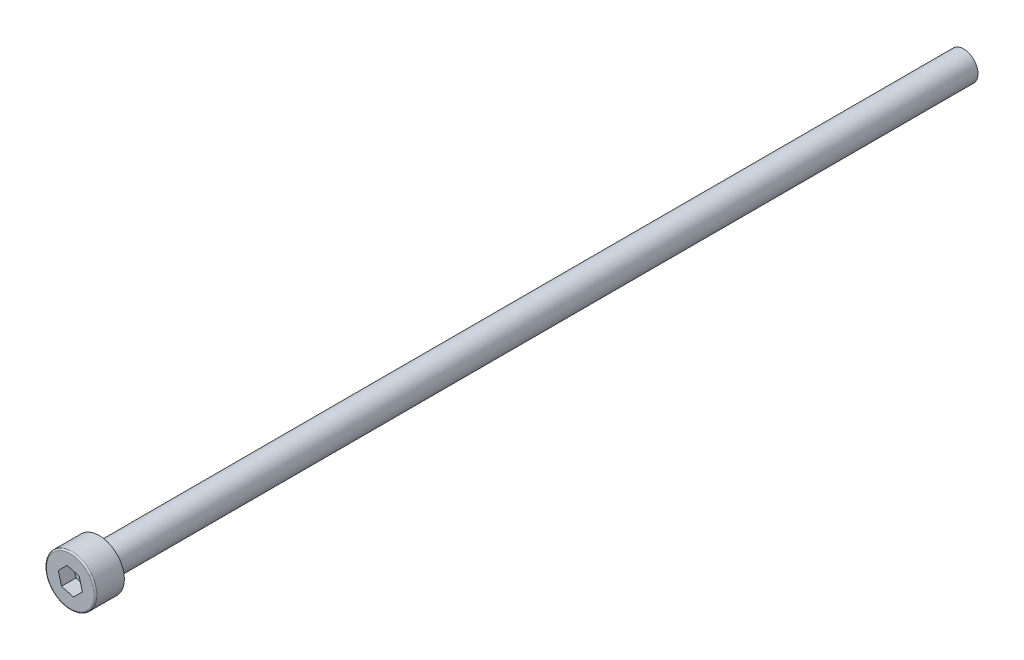
ISO-10303-21;
HEADER;
FILE_DESCRIPTION(('STEP AP214'),'2;1');
FILE_NAME('part.step','',(''),(''),'','','');
FILE_SCHEMA(('AUTOMOTIVE_DESIGN { 1 0 10303 214 1 1 1 1 }'));
ENDSEC;
DATA;
#1=APPLICATION_CONTEXT('core data for automotive mechanical design processes');
#2=APPLICATION_PROTOCOL_DEFINITION('international standard','automotive_design',2000,#1);
#3=PRODUCT_CONTEXT('',#1,'mechanical');
#4=PRODUCT('Part','Part','',(#3));
#5=PRODUCT_RELATED_PRODUCT_CATEGORY('part','',(#4));
#6=PRODUCT_DEFINITION_FORMATION('','',#4);
#7=PRODUCT_DEFINITION_CONTEXT('part definition',#1,'design');
#8=PRODUCT_DEFINITION('design','',#6,#7);
#9=PRODUCT_DEFINITION_SHAPE('','',#8);
#10=(LENGTH_UNIT() NAMED_UNIT(*) SI_UNIT(.MILLI.,.METRE.));
#11=(NAMED_UNIT(*) PLANE_ANGLE_UNIT() SI_UNIT($,.RADIAN.));
#12=(NAMED_UNIT(*) SI_UNIT($,.STERADIAN.) SOLID_ANGLE_UNIT());
#13=UNCERTAINTY_MEASURE_WITH_UNIT(LENGTH_MEASURE(1.E-05),#10,'distance_accuracy_value','');
#14=(GEOMETRIC_REPRESENTATION_CONTEXT(3) GLOBAL_UNCERTAINTY_ASSIGNED_CONTEXT((#13)) GLOBAL_UNIT_ASSIGNED_CONTEXT((#10,
#11,#12)) REPRESENTATION_CONTEXT('',''));
#15=CARTESIAN_POINT('',(0.,0.,0.));
#16=DIRECTION('',(0.,0.,1.));
#17=DIRECTION('',(1.,0.,0.));
#18=AXIS2_PLACEMENT_3D('',#15,#16,#17);
#19=CARTESIAN_POINT('',(0.,0.,0.));
#20=DIRECTION('',(0.,0.,1.));
#21=DIRECTION('',(1.,0.,0.));
#22=AXIS2_PLACEMENT_3D('',#19,#20,#21);
#23=PLANE('',#22);
#24=CARTESIAN_POINT('',(0.,0.,0.));
#25=DIRECTION('',(0.,0.,1.));
#26=DIRECTION('',(1.,0.,0.));
#27=AXIS2_PLACEMENT_3D('',#24,#25,#26);
#28=CIRCLE('',#27,3.5);
#29=CARTESIAN_POINT('',(3.5,0.,0.));
#30=VERTEX_POINT('',#29);
#31=EDGE_CURVE('E136',#30,#30,#28,.T.);
#32=ORIENTED_EDGE('',*,*,#31,.F.);
#33=EDGE_LOOP('',(#32));
#34=FACE_BOUND('',#33,.T.);
#35=CARTESIAN_POINT('',(0.,0.,0.));
#36=DIRECTION('',(0.,0.,1.));
#37=DIRECTION('',(1.,0.,0.));
#38=AXIS2_PLACEMENT_3D('',#35,#36,#37);
#39=CIRCLE('',#38,2.);
#40=CARTESIAN_POINT('',(2.,0.,0.));
#41=VERTEX_POINT('',#40);
#42=EDGE_CURVE('E144',#41,#41,#39,.F.);
#43=ORIENTED_EDGE('',*,*,#42,.F.);
#44=EDGE_LOOP('',(#43));
#45=FACE_BOUND('',#44,.T.);
#46=ADVANCED_FACE('F33',(#34,#45),#23,.F.);
#47=CARTESIAN_POINT('',(0.,0.,4.));
#48=DIRECTION('',(0.,0.,-1.));
#49=DIRECTION('',(-1.,0.,0.));
#50=AXIS2_PLACEMENT_3D('',#47,#48,#49);
#51=CYLINDRICAL_SURFACE('',#50,3.5);
#52=CARTESIAN_POINT('',(0.,0.,3.8));
#53=DIRECTION('',(0.,0.,1.));
#54=DIRECTION('',(1.,0.,0.));
#55=AXIS2_PLACEMENT_3D('',#52,#53,#54);
#56=CIRCLE('',#55,3.5);
#57=CARTESIAN_POINT('',(3.5,0.,3.8));
#58=VERTEX_POINT('',#57);
#59=EDGE_CURVE('E11',#58,#58,#56,.F.);
#60=ORIENTED_EDGE('',*,*,#59,.T.);
#61=EDGE_LOOP('',(#60));
#62=FACE_BOUND('',#61,.T.);
#63=ORIENTED_EDGE('',*,*,#31,.T.);
#64=EDGE_LOOP('',(#63));
#65=FACE_BOUND('',#64,.T.);
#66=ADVANCED_FACE('F163',(#62,#65),#51,.T.);
#67=CARTESIAN_POINT('',(0.,0.,4.));
#68=DIRECTION('',(0.,0.,1.));
#69=DIRECTION('',(1.,0.,0.));
#70=AXIS2_PLACEMENT_3D('',#67,#68,#69);
#71=PLANE('',#70);
#72=CARTESIAN_POINT('',(0.,0.,4.));
#73=DIRECTION('',(0.,0.,1.));
#74=DIRECTION('',(1.,0.,0.));
#75=AXIS2_PLACEMENT_3D('',#72,#73,#74);
#76=CIRCLE('',#75,3.3);
#77=CARTESIAN_POINT('',(3.3,0.,4.));
#78=VERTEX_POINT('',#77);
#79=EDGE_CURVE('E41',#78,#78,#76,.T.);
#80=ORIENTED_EDGE('',*,*,#79,.T.);
#81=EDGE_LOOP('',(#80));
#82=FACE_BOUND('',#81,.T.);
#83=DIRECTION('',(0.258819045102521,-0.965925826289068,0.));
#84=VECTOR('',#83,1.);
#85=CARTESIAN_POINT('',(-1.67303260747562,0.448287736084027,4.));
#86=LINE('',#85,#84);
#87=CARTESIAN_POINT('',(-1.67303260747562,0.448287736084027,4.));
#88=VERTEX_POINT('',#87);
#89=CARTESIAN_POINT('',(-1.22474487139159,-1.22474487139159,4.));
#90=VERTEX_POINT('',#89);
#91=EDGE_CURVE('E48',#88,#90,#86,.T.);
#92=ORIENTED_EDGE('',*,*,#91,.F.);
#93=DIRECTION('',(-0.707106781186547,-0.707106781186548,0.));
#94=VECTOR('',#93,1.);
#95=CARTESIAN_POINT('',(-0.448287736084027,1.67303260747562,4.));
#96=LINE('',#95,#94);
#97=CARTESIAN_POINT('',(-0.448287736084027,1.67303260747562,4.));
#98=VERTEX_POINT('',#97);
#99=EDGE_CURVE('E132',#98,#88,#96,.T.);
#100=ORIENTED_EDGE('',*,*,#99,.F.);
#101=DIRECTION('',(-0.965925826289068,0.258819045102521,0.));
#102=VECTOR('',#101,1.);
#103=CARTESIAN_POINT('',(1.22474487139159,1.22474487139159,4.));
#104=LINE('',#103,#102);
#105=CARTESIAN_POINT('',(1.22474487139159,1.22474487139159,4.));
#106=VERTEX_POINT('',#105);
#107=EDGE_CURVE('E130',#106,#98,#104,.T.);
#108=ORIENTED_EDGE('',*,*,#107,.F.);
#109=DIRECTION('',(-0.258819045102521,0.965925826289068,0.));
#110=VECTOR('',#109,1.);
#111=CARTESIAN_POINT('',(1.67303260747562,-0.448287736084027,4.));
#112=LINE('',#111,#110);
#113=CARTESIAN_POINT('',(1.67303260747562,-0.448287736084027,4.));
#114=VERTEX_POINT('',#113);
#115=EDGE_CURVE('E96',#114,#106,#112,.T.);
#116=ORIENTED_EDGE('',*,*,#115,.F.);
#117=DIRECTION('',(0.707106781186547,0.707106781186548,0.));
#118=VECTOR('',#117,1.);
#119=CARTESIAN_POINT('',(0.448287736084026,-1.67303260747562,4.));
#120=LINE('',#119,#118);
#121=CARTESIAN_POINT('',(0.448287736084026,-1.67303260747562,4.));
#122=VERTEX_POINT('',#121);
#123=EDGE_CURVE('E126',#122,#114,#120,.T.);
#124=ORIENTED_EDGE('',*,*,#123,.F.);
#125=DIRECTION('',(0.965925826289068,-0.258819045102521,0.));
#126=VECTOR('',#125,1.);
#127=CARTESIAN_POINT('',(-1.22474487139159,-1.22474487139159,4.));
#128=LINE('',#127,#126);
#129=EDGE_CURVE('E122',#90,#122,#128,.T.);
#130=ORIENTED_EDGE('',*,*,#129,.F.);
#131=EDGE_LOOP('',(#92,#100,#108,#116,#124,#130));
#132=FACE_BOUND('',#131,.T.);
#133=ADVANCED_FACE('F149',(#82,#132),#71,.T.);
#134=CARTESIAN_POINT('',(-1.67303260747562,0.448287736084027,2.));
#135=DIRECTION('',(-0.965925826289068,-0.258819045102521,0.));
#136=DIRECTION('',(0.258819045102521,-0.965925826289068,0.));
#137=AXIS2_PLACEMENT_3D('',#134,#135,#136);
#138=PLANE('',#137);
#139=ORIENTED_EDGE('',*,*,#91,.T.);
#140=DIRECTION('',(0.,0.,1.));
#141=VECTOR('',#140,1.);
#142=CARTESIAN_POINT('',(-1.22474487139159,-1.22474487139159,2.));
#143=LINE('',#142,#141);
#144=CARTESIAN_POINT('',(-1.22474487139159,-1.22474487139159,2.));
#145=VERTEX_POINT('',#144);
#146=EDGE_CURVE('E78',#145,#90,#143,.T.);
#147=ORIENTED_EDGE('',*,*,#146,.F.);
#148=DIRECTION('',(0.258819045102521,-0.965925826289068,0.));
#149=VECTOR('',#148,1.);
#150=CARTESIAN_POINT('',(-1.67303260747562,0.448287736084027,2.));
#151=LINE('',#150,#149);
#152=CARTESIAN_POINT('',(-1.67303260747562,0.448287736084027,2.));
#153=VERTEX_POINT('',#152);
#154=EDGE_CURVE('E134',#153,#145,#151,.T.);
#155=ORIENTED_EDGE('',*,*,#154,.F.);
#156=DIRECTION('',(0.,0.,1.));
#157=VECTOR('',#156,1.);
#158=CARTESIAN_POINT('',(-1.67303260747562,0.448287736084027,2.));
#159=LINE('',#158,#157);
#160=EDGE_CURVE('E56',#153,#88,#159,.T.);
#161=ORIENTED_EDGE('',*,*,#160,.T.);
#162=EDGE_LOOP('',(#139,#147,#155,#161));
#163=FACE_BOUND('',#162,.T.);
#164=ADVANCED_FACE('F175',(#163),#138,.F.);
#165=CARTESIAN_POINT('',(-0.448287736084027,1.67303260747562,2.));
#166=DIRECTION('',(-0.707106781186548,0.707106781186547,0.));
#167=DIRECTION('',(-0.707106781186547,-0.707106781186548,0.));
#168=AXIS2_PLACEMENT_3D('',#165,#166,#167);
#169=PLANE('',#168);
#170=ORIENTED_EDGE('',*,*,#99,.T.);
#171=ORIENTED_EDGE('',*,*,#160,.F.);
#172=DIRECTION('',(-0.707106781186547,-0.707106781186548,0.));
#173=VECTOR('',#172,1.);
#174=CARTESIAN_POINT('',(-0.448287736084027,1.67303260747562,2.));
#175=LINE('',#174,#173);
#176=CARTESIAN_POINT('',(-0.448287736084027,1.67303260747562,2.));
#177=VERTEX_POINT('',#176);
#178=EDGE_CURVE('E108',#177,#153,#175,.T.);
#179=ORIENTED_EDGE('',*,*,#178,.F.);
#180=DIRECTION('',(0.,0.,1.));
#181=VECTOR('',#180,1.);
#182=CARTESIAN_POINT('',(-0.448287736084027,1.67303260747562,2.));
#183=LINE('',#182,#181);
#184=EDGE_CURVE('E100',#177,#98,#183,.T.);
#185=ORIENTED_EDGE('',*,*,#184,.T.);
#186=EDGE_LOOP('',(#170,#171,#179,#185));
#187=FACE_BOUND('',#186,.T.);
#188=ADVANCED_FACE('F178',(#187),#169,.F.);
#189=CARTESIAN_POINT('',(1.22474487139159,1.22474487139159,2.));
#190=DIRECTION('',(0.258819045102521,0.965925826289068,0.));
#191=DIRECTION('',(-0.965925826289068,0.258819045102521,0.));
#192=AXIS2_PLACEMENT_3D('',#189,#190,#191);
#193=PLANE('',#192);
#194=ORIENTED_EDGE('',*,*,#107,.T.);
#195=ORIENTED_EDGE('',*,*,#184,.F.);
#196=DIRECTION('',(-0.965925826289068,0.258819045102521,0.));
#197=VECTOR('',#196,1.);
#198=CARTESIAN_POINT('',(1.22474487139159,1.22474487139159,2.));
#199=LINE('',#198,#197);
#200=CARTESIAN_POINT('',(1.22474487139159,1.22474487139159,2.));
#201=VERTEX_POINT('',#200);
#202=EDGE_CURVE('E104',#201,#177,#199,.T.);
#203=ORIENTED_EDGE('',*,*,#202,.F.);
#204=DIRECTION('',(0.,0.,1.));
#205=VECTOR('',#204,1.);
#206=CARTESIAN_POINT('',(1.22474487139159,1.22474487139159,2.));
#207=LINE('',#206,#205);
#208=EDGE_CURVE('E89',#201,#106,#207,.T.);
#209=ORIENTED_EDGE('',*,*,#208,.T.);
#210=EDGE_LOOP('',(#194,#195,#203,#209));
#211=FACE_BOUND('',#210,.T.);
#212=ADVANCED_FACE('F105',(#211),#193,.F.);
#213=CARTESIAN_POINT('',(1.67303260747562,-0.448287736084027,2.));
#214=DIRECTION('',(0.965925826289068,0.258819045102521,0.));
#215=DIRECTION('',(-0.258819045102521,0.965925826289068,0.));
#216=AXIS2_PLACEMENT_3D('',#213,#214,#215);
#217=PLANE('',#216);
#218=ORIENTED_EDGE('',*,*,#115,.T.);
#219=ORIENTED_EDGE('',*,*,#208,.F.);
#220=DIRECTION('',(-0.258819045102521,0.965925826289068,0.));
#221=VECTOR('',#220,1.);
#222=CARTESIAN_POINT('',(1.67303260747562,-0.448287736084027,2.));
#223=LINE('',#222,#221);
#224=CARTESIAN_POINT('',(1.67303260747562,-0.448287736084027,2.));
#225=VERTEX_POINT('',#224);
#226=EDGE_CURVE('E93',#225,#201,#223,.T.);
#227=ORIENTED_EDGE('',*,*,#226,.F.);
#228=DIRECTION('',(0.,0.,1.));
#229=VECTOR('',#228,1.);
#230=CARTESIAN_POINT('',(1.67303260747562,-0.448287736084027,2.));
#231=LINE('',#230,#229);
#232=EDGE_CURVE('E101',#225,#114,#231,.T.);
#233=ORIENTED_EDGE('',*,*,#232,.T.);
#234=EDGE_LOOP('',(#218,#219,#227,#233));
#235=FACE_BOUND('',#234,.T.);
#236=ADVANCED_FACE('F91',(#235),#217,.F.);
#237=CARTESIAN_POINT('',(0.448287736084026,-1.67303260747562,2.));
#238=DIRECTION('',(0.707106781186548,-0.707106781186547,0.));
#239=DIRECTION('',(0.707106781186547,0.707106781186548,0.));
#240=AXIS2_PLACEMENT_3D('',#237,#238,#239);
#241=PLANE('',#240);
#242=ORIENTED_EDGE('',*,*,#123,.T.);
#243=ORIENTED_EDGE('',*,*,#232,.F.);
#244=DIRECTION('',(0.707106781186547,0.707106781186548,0.));
#245=VECTOR('',#244,1.);
#246=CARTESIAN_POINT('',(0.448287736084026,-1.67303260747562,2.));
#247=LINE('',#246,#245);
#248=CARTESIAN_POINT('',(0.448287736084026,-1.67303260747562,2.));
#249=VERTEX_POINT('',#248);
#250=EDGE_CURVE('E114',#249,#225,#247,.T.);
#251=ORIENTED_EDGE('',*,*,#250,.F.);
#252=DIRECTION('',(0.,0.,1.));
#253=VECTOR('',#252,1.);
#254=CARTESIAN_POINT('',(0.448287736084026,-1.67303260747562,2.));
#255=LINE('',#254,#253);
#256=EDGE_CURVE('E139',#249,#122,#255,.T.);
#257=ORIENTED_EDGE('',*,*,#256,.T.);
#258=EDGE_LOOP('',(#242,#243,#251,#257));
#259=FACE_BOUND('',#258,.T.);
#260=ADVANCED_FACE('F182',(#259),#241,.F.);
#261=CARTESIAN_POINT('',(-1.22474487139159,-1.22474487139159,2.));
#262=DIRECTION('',(-0.258819045102521,-0.965925826289068,0.));
#263=DIRECTION('',(0.965925826289068,-0.258819045102521,0.));
#264=AXIS2_PLACEMENT_3D('',#261,#262,#263);
#265=PLANE('',#264);
#266=ORIENTED_EDGE('',*,*,#129,.T.);
#267=ORIENTED_EDGE('',*,*,#256,.F.);
#268=DIRECTION('',(0.965925826289068,-0.258819045102521,0.));
#269=VECTOR('',#268,1.);
#270=CARTESIAN_POINT('',(-1.22474487139159,-1.22474487139159,2.));
#271=LINE('',#270,#269);
#272=EDGE_CURVE('E116',#145,#249,#271,.T.);
#273=ORIENTED_EDGE('',*,*,#272,.F.);
#274=ORIENTED_EDGE('',*,*,#146,.T.);
#275=EDGE_LOOP('',(#266,#267,#273,#274));
#276=FACE_BOUND('',#275,.T.);
#277=ADVANCED_FACE('F179',(#276),#265,.F.);
#278=CARTESIAN_POINT('',(0.,0.,2.));
#279=DIRECTION('',(0.,0.,1.));
#280=DIRECTION('',(1.,0.,0.));
#281=AXIS2_PLACEMENT_3D('',#278,#279,#280);
#282=PLANE('',#281);
#283=ORIENTED_EDGE('',*,*,#154,.T.);
#284=ORIENTED_EDGE('',*,*,#272,.T.);
#285=ORIENTED_EDGE('',*,*,#250,.T.);
#286=ORIENTED_EDGE('',*,*,#226,.T.);
#287=ORIENTED_EDGE('',*,*,#202,.T.);
#288=ORIENTED_EDGE('',*,*,#178,.T.);
#289=EDGE_LOOP('',(#283,#284,#285,#286,#287,#288));
#290=FACE_BOUND('',#289,.T.);
#291=ADVANCED_FACE('F111',(#290),#282,.T.);
#292=CARTESIAN_POINT('',(0.,0.,-120.));
#293=DIRECTION('',(0.,0.,1.));
#294=DIRECTION('',(1.,0.,0.));
#295=AXIS2_PLACEMENT_3D('',#292,#293,#294);
#296=CYLINDRICAL_SURFACE('',#295,2.);
#297=CARTESIAN_POINT('',(0.,0.,-120.));
#298=DIRECTION('',(0.,0.,-1.));
#299=DIRECTION('',(-1.,0.,0.));
#300=AXIS2_PLACEMENT_3D('',#297,#298,#299);
#301=CIRCLE('',#300,2.);
#302=CARTESIAN_POINT('',(-2.,0.,-120.));
#303=VERTEX_POINT('',#302);
#304=EDGE_CURVE('E123',#303,#303,#301,.T.);
#305=ORIENTED_EDGE('',*,*,#304,.F.);
#306=EDGE_LOOP('',(#305));
#307=FACE_BOUND('',#306,.T.);
#308=ORIENTED_EDGE('',*,*,#42,.T.);
#309=EDGE_LOOP('',(#308));
#310=FACE_BOUND('',#309,.T.);
#311=ADVANCED_FACE('F158',(#307,#310),#296,.T.);
#312=CARTESIAN_POINT('',(0.,0.,-120.));
#313=DIRECTION('',(0.,0.,-1.));
#314=DIRECTION('',(-1.,0.,0.));
#315=AXIS2_PLACEMENT_3D('',#312,#313,#314);
#316=PLANE('',#315);
#317=ORIENTED_EDGE('',*,*,#304,.T.);
#318=EDGE_LOOP('',(#317));
#319=FACE_BOUND('',#318,.T.);
#320=ADVANCED_FACE('F153',(#319),#316,.T.);
#321=CARTESIAN_POINT('',(0.,0.,3.8));
#322=DIRECTION('',(0.,0.,1.));
#323=DIRECTION('',(1.,0.,0.));
#324=AXIS2_PLACEMENT_3D('',#321,#322,#323);
#325=TOROIDAL_SURFACE('',#324,3.3,0.2);
#326=ORIENTED_EDGE('',*,*,#59,.F.);
#327=EDGE_LOOP('',(#326));
#328=FACE_BOUND('',#327,.T.);
#329=ORIENTED_EDGE('',*,*,#79,.F.);
#330=EDGE_LOOP('',(#329));
#331=FACE_BOUND('',#330,.T.);
#332=ADVANCED_FACE('F35',(#328,#331),#325,.T.);
#333=CLOSED_SHELL('',(#46,#66,#133,#164,#188,#212,#236,#260,#277,#291,#311,#320,#332));
#334=MANIFOLD_SOLID_BREP('B2',#333);
#335=ADVANCED_BREP_SHAPE_REPRESENTATION('',(#18,#334),#14);
#336=SHAPE_DEFINITION_REPRESENTATION(#9,#335);
ENDSEC;
END-ISO-10303-21;
